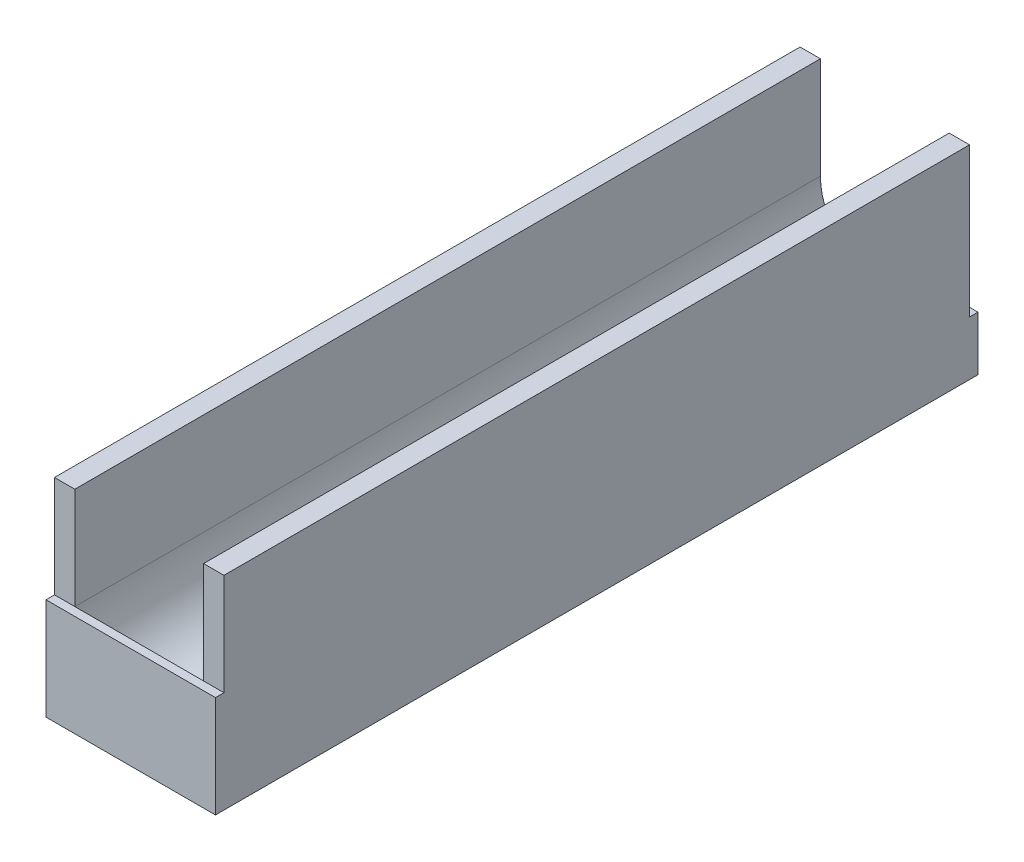
ISO-10303-21;
HEADER;
FILE_DESCRIPTION(('STEP AP214'),'2;1');
FILE_NAME('part.step','',(''),(''),'','','');
FILE_SCHEMA(('AUTOMOTIVE_DESIGN { 1 0 10303 214 1 1 1 1 }'));
ENDSEC;
DATA;
#1=APPLICATION_CONTEXT('core data for automotive mechanical design processes');
#2=APPLICATION_PROTOCOL_DEFINITION('international standard','automotive_design',2000,#1);
#3=PRODUCT_CONTEXT('',#1,'mechanical');
#4=PRODUCT('Part','Part','',(#3));
#5=PRODUCT_RELATED_PRODUCT_CATEGORY('part','',(#4));
#6=PRODUCT_DEFINITION_FORMATION('','',#4);
#7=PRODUCT_DEFINITION_CONTEXT('part definition',#1,'design');
#8=PRODUCT_DEFINITION('design','',#6,#7);
#9=PRODUCT_DEFINITION_SHAPE('','',#8);
#10=(LENGTH_UNIT() NAMED_UNIT(*) SI_UNIT(.MILLI.,.METRE.));
#11=(NAMED_UNIT(*) PLANE_ANGLE_UNIT() SI_UNIT($,.RADIAN.));
#12=(NAMED_UNIT(*) SI_UNIT($,.STERADIAN.) SOLID_ANGLE_UNIT());
#13=UNCERTAINTY_MEASURE_WITH_UNIT(LENGTH_MEASURE(1.E-05),#10,'distance_accuracy_value','');
#14=(GEOMETRIC_REPRESENTATION_CONTEXT(3) GLOBAL_UNCERTAINTY_ASSIGNED_CONTEXT((#13)) GLOBAL_UNIT_ASSIGNED_CONTEXT((#10,
#11,#12)) REPRESENTATION_CONTEXT('',''));
#15=CARTESIAN_POINT('',(0.,0.,0.));
#16=DIRECTION('',(0.,0.,1.));
#17=DIRECTION('',(1.,0.,0.));
#18=AXIS2_PLACEMENT_3D('',#15,#16,#17);
#19=CARTESIAN_POINT('',(0.,0.,0.));
#20=DIRECTION('',(0.,0.,-1.));
#21=DIRECTION('',(-1.,0.,0.));
#22=AXIS2_PLACEMENT_3D('',#19,#20,#21);
#23=PLANE('',#22);
#24=DIRECTION('',(1.,0.,0.));
#25=VECTOR('',#24,1.);
#26=CARTESIAN_POINT('',(15.875,10.16,0.));
#27=LINE('',#26,#25);
#28=CARTESIAN_POINT('',(-15.875,10.16,0.));
#29=VERTEX_POINT('',#28);
#30=CARTESIAN_POINT('',(-8.15672268745235,10.16,0.));
#31=VERTEX_POINT('',#30);
#32=EDGE_CURVE('E48',#29,#31,#27,.T.);
#33=ORIENTED_EDGE('',*,*,#32,.F.);
#34=DIRECTION('',(0.,-1.,0.));
#35=VECTOR('',#34,1.);
#36=CARTESIAN_POINT('',(-15.875,0.,0.));
#37=LINE('',#36,#35);
#38=CARTESIAN_POINT('',(-15.875,38.1,0.));
#39=VERTEX_POINT('',#38);
#40=EDGE_CURVE('E220',#39,#29,#37,.T.);
#41=ORIENTED_EDGE('',*,*,#40,.F.);
#42=DIRECTION('',(-1.,0.,0.));
#43=VECTOR('',#42,1.);
#44=CARTESIAN_POINT('',(-15.875,38.1,0.));
#45=LINE('',#44,#43);
#46=CARTESIAN_POINT('',(-12.065,38.1,0.));
#47=VERTEX_POINT('',#46);
#48=EDGE_CURVE('E240',#47,#39,#45,.T.);
#49=ORIENTED_EDGE('',*,*,#48,.F.);
#50=DIRECTION('',(0.,-1.,0.));
#51=VECTOR('',#50,1.);
#52=CARTESIAN_POINT('',(-12.065,19.05,0.));
#53=LINE('',#52,#51);
#54=CARTESIAN_POINT('',(-12.065,19.05,0.));
#55=VERTEX_POINT('',#54);
#56=EDGE_CURVE('E206',#47,#55,#53,.T.);
#57=ORIENTED_EDGE('',*,*,#56,.T.);
#58=CARTESIAN_POINT('',(0.,19.05,0.));
#59=DIRECTION('',(0.,0.,1.));
#60=DIRECTION('',(1.,0.,0.));
#61=AXIS2_PLACEMENT_3D('',#58,#59,#60);
#62=CIRCLE('',#61,12.065);
#63=EDGE_CURVE('E199',#55,#31,#62,.T.);
#64=ORIENTED_EDGE('',*,*,#63,.T.);
#65=EDGE_LOOP('',(#33,#41,#49,#57,#64));
#66=FACE_BOUND('',#65,.T.);
#67=ADVANCED_FACE('F37',(#66),#23,.T.);
#68=CARTESIAN_POINT('',(0.,0.,139.7));
#69=DIRECTION('',(0.,0.,-1.));
#70=DIRECTION('',(-1.,0.,0.));
#71=AXIS2_PLACEMENT_3D('',#68,#69,#70);
#72=PLANE('',#71);
#73=DIRECTION('',(-1.,0.,0.));
#74=VECTOR('',#73,1.);
#75=CARTESIAN_POINT('',(15.875,19.05,139.7));
#76=LINE('',#75,#74);
#77=CARTESIAN_POINT('',(15.875,19.05,139.7));
#78=VERTEX_POINT('',#77);
#79=CARTESIAN_POINT('',(12.065,19.05,139.7));
#80=VERTEX_POINT('',#79);
#81=EDGE_CURVE('E171',#78,#80,#76,.T.);
#82=ORIENTED_EDGE('',*,*,#81,.F.);
#83=DIRECTION('',(0.,1.,0.));
#84=VECTOR('',#83,1.);
#85=CARTESIAN_POINT('',(15.875,0.,139.7));
#86=LINE('',#85,#84);
#87=CARTESIAN_POINT('',(15.875,38.1,139.7));
#88=VERTEX_POINT('',#87);
#89=EDGE_CURVE('E229',#78,#88,#86,.T.);
#90=ORIENTED_EDGE('',*,*,#89,.T.);
#91=DIRECTION('',(-1.,0.,0.));
#92=VECTOR('',#91,1.);
#93=CARTESIAN_POINT('',(-15.875,38.1,139.7));
#94=LINE('',#93,#92);
#95=CARTESIAN_POINT('',(12.065,38.1,139.7));
#96=VERTEX_POINT('',#95);
#97=EDGE_CURVE('E233',#88,#96,#94,.T.);
#98=ORIENTED_EDGE('',*,*,#97,.T.);
#99=DIRECTION('',(0.,1.,0.));
#100=VECTOR('',#99,1.);
#101=CARTESIAN_POINT('',(12.065,19.05,139.7));
#102=LINE('',#101,#100);
#103=EDGE_CURVE('E212',#80,#96,#102,.T.);
#104=ORIENTED_EDGE('',*,*,#103,.F.);
#105=EDGE_LOOP('',(#82,#90,#98,#104));
#106=FACE_BOUND('',#105,.T.);
#107=ADVANCED_FACE('F259',(#106),#72,.F.);
#108=CARTESIAN_POINT('',(-12.065,19.05,139.7));
#109=VERTEX_POINT('',#108);
#110=CARTESIAN_POINT('',(-15.875,19.05,139.7));
#111=VERTEX_POINT('',#110);
#112=EDGE_CURVE('E46',#109,#111,#76,.T.);
#113=ORIENTED_EDGE('',*,*,#112,.F.);
#114=DIRECTION('',(0.,-1.,0.));
#115=VECTOR('',#114,1.);
#116=CARTESIAN_POINT('',(-12.065,19.05,139.7));
#117=LINE('',#116,#115);
#118=CARTESIAN_POINT('',(-12.065,38.1,139.7));
#119=VERTEX_POINT('',#118);
#120=EDGE_CURVE('E214',#119,#109,#117,.T.);
#121=ORIENTED_EDGE('',*,*,#120,.F.);
#122=CARTESIAN_POINT('',(-15.875,38.1,139.7));
#123=VERTEX_POINT('',#122);
#124=EDGE_CURVE('E232',#119,#123,#94,.T.);
#125=ORIENTED_EDGE('',*,*,#124,.T.);
#126=DIRECTION('',(0.,-1.,0.));
#127=VECTOR('',#126,1.);
#128=CARTESIAN_POINT('',(-15.875,0.,139.7));
#129=LINE('',#128,#127);
#130=EDGE_CURVE('E227',#123,#111,#129,.T.);
#131=ORIENTED_EDGE('',*,*,#130,.T.);
#132=EDGE_LOOP('',(#113,#121,#125,#131));
#133=FACE_BOUND('',#132,.T.);
#134=ADVANCED_FACE('F284',(#133),#72,.F.);
#135=CARTESIAN_POINT('',(-15.875,38.1,139.7));
#136=DIRECTION('',(0.,-1.,0.));
#137=DIRECTION('',(0.,0.,-1.));
#138=AXIS2_PLACEMENT_3D('',#135,#136,#137);
#139=PLANE('',#138);
#140=ORIENTED_EDGE('',*,*,#124,.F.);
#141=DIRECTION('',(0.,0.,1.));
#142=VECTOR('',#141,1.);
#143=CARTESIAN_POINT('',(-12.065,38.1,0.));
#144=LINE('',#143,#142);
#145=EDGE_CURVE('E221',#47,#119,#144,.T.);
#146=ORIENTED_EDGE('',*,*,#145,.F.);
#147=ORIENTED_EDGE('',*,*,#48,.T.);
#148=DIRECTION('',(0.,0.,-1.));
#149=VECTOR('',#148,1.);
#150=CARTESIAN_POINT('',(-15.875,38.1,139.7));
#151=LINE('',#150,#149);
#152=EDGE_CURVE('E236',#123,#39,#151,.T.);
#153=ORIENTED_EDGE('',*,*,#152,.F.);
#154=EDGE_LOOP('',(#140,#146,#147,#153));
#155=FACE_BOUND('',#154,.T.);
#156=ADVANCED_FACE('F287',(#155),#139,.F.);
#157=CARTESIAN_POINT('',(-15.875,0.,139.7));
#158=DIRECTION('',(1.,0.,0.));
#159=DIRECTION('',(0.,0.,-1.));
#160=AXIS2_PLACEMENT_3D('',#157,#158,#159);
#161=PLANE('',#160);
#162=ORIENTED_EDGE('',*,*,#40,.T.);
#163=DIRECTION('',(0.,0.,1.));
#164=VECTOR('',#163,1.);
#165=CARTESIAN_POINT('',(-15.875,10.16,-1.5875));
#166=LINE('',#165,#164);
#167=CARTESIAN_POINT('',(-15.875,10.16,-1.5875));
#168=VERTEX_POINT('',#167);
#169=EDGE_CURVE('E165',#168,#29,#166,.T.);
#170=ORIENTED_EDGE('',*,*,#169,.F.);
#171=DIRECTION('',(0.,1.,0.));
#172=VECTOR('',#171,1.);
#173=CARTESIAN_POINT('',(-15.875,0.,-1.5875));
#174=LINE('',#173,#172);
#175=CARTESIAN_POINT('',(-15.875,0.,-1.5875));
#176=VERTEX_POINT('',#175);
#177=EDGE_CURVE('E153',#176,#168,#174,.T.);
#178=ORIENTED_EDGE('',*,*,#177,.F.);
#179=DIRECTION('',(0.,0.,-1.));
#180=VECTOR('',#179,1.);
#181=CARTESIAN_POINT('',(-15.875,0.,139.7));
#182=LINE('',#181,#180);
#183=CARTESIAN_POINT('',(-15.875,0.,141.2875));
#184=VERTEX_POINT('',#183);
#185=EDGE_CURVE('E41',#184,#176,#182,.T.);
#186=ORIENTED_EDGE('',*,*,#185,.F.);
#187=DIRECTION('',(0.,-1.,0.));
#188=VECTOR('',#187,1.);
#189=CARTESIAN_POINT('',(-15.875,0.,141.2875));
#190=LINE('',#189,#188);
#191=CARTESIAN_POINT('',(-15.875,19.05,141.2875));
#192=VERTEX_POINT('',#191);
#193=EDGE_CURVE('E173',#192,#184,#190,.T.);
#194=ORIENTED_EDGE('',*,*,#193,.F.);
#195=DIRECTION('',(0.,0.,-1.));
#196=VECTOR('',#195,1.);
#197=CARTESIAN_POINT('',(-15.875,19.05,141.2875));
#198=LINE('',#197,#196);
#199=EDGE_CURVE('E178',#192,#111,#198,.T.);
#200=ORIENTED_EDGE('',*,*,#199,.T.);
#201=ORIENTED_EDGE('',*,*,#130,.F.);
#202=ORIENTED_EDGE('',*,*,#152,.T.);
#203=EDGE_LOOP('',(#162,#170,#178,#186,#194,#200,#201,#202));
#204=FACE_BOUND('',#203,.T.);
#205=ADVANCED_FACE('F39',(#204),#161,.F.);
#206=CARTESIAN_POINT('',(-15.875,0.,139.7));
#207=DIRECTION('',(0.,1.,0.));
#208=DIRECTION('',(0.,0.,1.));
#209=AXIS2_PLACEMENT_3D('',#206,#207,#208);
#210=PLANE('',#209);
#211=CARTESIAN_POINT('',(-12.7,0.,130.81));
#212=DIRECTION('',(0.,-1.,0.));
#213=DIRECTION('',(0.,0.,-1.));
#214=AXIS2_PLACEMENT_3D('',#211,#212,#213);
#215=CIRCLE('',#214,2.);
#216=CARTESIAN_POINT('',(-12.7,0.,128.81));
#217=VERTEX_POINT('',#216);
#218=EDGE_CURVE('E191',#217,#217,#215,.T.);
#219=ORIENTED_EDGE('',*,*,#218,.F.);
#220=EDGE_LOOP('',(#219));
#221=FACE_BOUND('',#220,.T.);
#222=CARTESIAN_POINT('',(12.7,0.,8.89));
#223=DIRECTION('',(0.,-1.,0.));
#224=DIRECTION('',(0.,0.,-1.));
#225=AXIS2_PLACEMENT_3D('',#222,#223,#224);
#226=CIRCLE('',#225,2.);
#227=CARTESIAN_POINT('',(12.7,0.,6.89));
#228=VERTEX_POINT('',#227);
#229=EDGE_CURVE('E194',#228,#228,#226,.T.);
#230=ORIENTED_EDGE('',*,*,#229,.F.);
#231=EDGE_LOOP('',(#230));
#232=FACE_BOUND('',#231,.T.);
#233=ORIENTED_EDGE('',*,*,#185,.T.);
#234=DIRECTION('',(-1.,0.,0.));
#235=VECTOR('',#234,1.);
#236=CARTESIAN_POINT('',(15.875,0.,-1.5875));
#237=LINE('',#236,#235);
#238=CARTESIAN_POINT('',(15.875,0.,-1.5875));
#239=VERTEX_POINT('',#238);
#240=EDGE_CURVE('E149',#239,#176,#237,.T.);
#241=ORIENTED_EDGE('',*,*,#240,.F.);
#242=DIRECTION('',(0.,0.,-1.));
#243=VECTOR('',#242,1.);
#244=CARTESIAN_POINT('',(15.875,0.,139.7));
#245=LINE('',#244,#243);
#246=CARTESIAN_POINT('',(15.875,0.,141.2875));
#247=VERTEX_POINT('',#246);
#248=EDGE_CURVE('E135',#247,#239,#245,.T.);
#249=ORIENTED_EDGE('',*,*,#248,.F.);
#250=DIRECTION('',(1.,0.,0.));
#251=VECTOR('',#250,1.);
#252=CARTESIAN_POINT('',(15.875,0.,141.2875));
#253=LINE('',#252,#251);
#254=EDGE_CURVE('E176',#184,#247,#253,.T.);
#255=ORIENTED_EDGE('',*,*,#254,.F.);
#256=EDGE_LOOP('',(#233,#241,#249,#255));
#257=FACE_BOUND('',#256,.T.);
#258=ADVANCED_FACE('F150',(#221,#232,#257),#210,.F.);
#259=CARTESIAN_POINT('',(15.875,0.,139.7));
#260=DIRECTION('',(-1.,0.,0.));
#261=DIRECTION('',(0.,0.,1.));
#262=AXIS2_PLACEMENT_3D('',#259,#260,#261);
#263=PLANE('',#262);
#264=ORIENTED_EDGE('',*,*,#248,.T.);
#265=DIRECTION('',(0.,-1.,0.));
#266=VECTOR('',#265,1.);
#267=CARTESIAN_POINT('',(15.875,0.,-1.5875));
#268=LINE('',#267,#266);
#269=CARTESIAN_POINT('',(15.875,10.16,-1.5875));
#270=VERTEX_POINT('',#269);
#271=EDGE_CURVE('E140',#270,#239,#268,.T.);
#272=ORIENTED_EDGE('',*,*,#271,.F.);
#273=DIRECTION('',(0.,0.,1.));
#274=VECTOR('',#273,1.);
#275=CARTESIAN_POINT('',(15.875,10.16,-1.5875));
#276=LINE('',#275,#274);
#277=CARTESIAN_POINT('',(15.875,10.16,0.));
#278=VERTEX_POINT('',#277);
#279=EDGE_CURVE('E162',#270,#278,#276,.T.);
#280=ORIENTED_EDGE('',*,*,#279,.T.);
#281=DIRECTION('',(0.,1.,0.));
#282=VECTOR('',#281,1.);
#283=CARTESIAN_POINT('',(15.875,0.,0.));
#284=LINE('',#283,#282);
#285=CARTESIAN_POINT('',(15.875,38.1,0.));
#286=VERTEX_POINT('',#285);
#287=EDGE_CURVE('E238',#278,#286,#284,.T.);
#288=ORIENTED_EDGE('',*,*,#287,.T.);
#289=DIRECTION('',(0.,0.,-1.));
#290=VECTOR('',#289,1.);
#291=CARTESIAN_POINT('',(15.875,38.1,139.7));
#292=LINE('',#291,#290);
#293=EDGE_CURVE('E147',#88,#286,#292,.T.);
#294=ORIENTED_EDGE('',*,*,#293,.F.);
#295=ORIENTED_EDGE('',*,*,#89,.F.);
#296=DIRECTION('',(0.,0.,-1.));
#297=VECTOR('',#296,1.);
#298=CARTESIAN_POINT('',(15.875,19.05,141.2875));
#299=LINE('',#298,#297);
#300=CARTESIAN_POINT('',(15.875,19.05,141.2875));
#301=VERTEX_POINT('',#300);
#302=EDGE_CURVE('E183',#301,#78,#299,.T.);
#303=ORIENTED_EDGE('',*,*,#302,.F.);
#304=DIRECTION('',(0.,1.,0.));
#305=VECTOR('',#304,1.);
#306=CARTESIAN_POINT('',(15.875,0.,141.2875));
#307=LINE('',#306,#305);
#308=EDGE_CURVE('E143',#247,#301,#307,.T.);
#309=ORIENTED_EDGE('',*,*,#308,.F.);
#310=EDGE_LOOP('',(#264,#272,#280,#288,#294,#295,#303,#309));
#311=FACE_BOUND('',#310,.T.);
#312=ADVANCED_FACE('F137',(#311),#263,.F.);
#313=CARTESIAN_POINT('',(12.065,38.1,0.));
#314=VERTEX_POINT('',#313);
#315=EDGE_CURVE('E230',#286,#314,#45,.T.);
#316=ORIENTED_EDGE('',*,*,#315,.T.);
#317=DIRECTION('',(0.,0.,1.));
#318=VECTOR('',#317,1.);
#319=CARTESIAN_POINT('',(12.065,38.1,0.));
#320=LINE('',#319,#318);
#321=EDGE_CURVE('E223',#314,#96,#320,.T.);
#322=ORIENTED_EDGE('',*,*,#321,.T.);
#323=ORIENTED_EDGE('',*,*,#97,.F.);
#324=ORIENTED_EDGE('',*,*,#293,.T.);
#325=EDGE_LOOP('',(#316,#322,#323,#324));
#326=FACE_BOUND('',#325,.T.);
#327=ADVANCED_FACE('F250',(#326),#139,.F.);
#328=CARTESIAN_POINT('',(8.15672268745235,10.16,0.));
#329=VERTEX_POINT('',#328);
#330=EDGE_CURVE('E11',#329,#278,#27,.T.);
#331=ORIENTED_EDGE('',*,*,#330,.F.);
#332=CARTESIAN_POINT('',(12.065,19.05,0.));
#333=VERTEX_POINT('',#332);
#334=EDGE_CURVE('E203',#329,#333,#62,.T.);
#335=ORIENTED_EDGE('',*,*,#334,.T.);
#336=DIRECTION('',(0.,1.,0.));
#337=VECTOR('',#336,1.);
#338=CARTESIAN_POINT('',(12.065,19.05,0.));
#339=LINE('',#338,#337);
#340=EDGE_CURVE('E201',#333,#314,#339,.T.);
#341=ORIENTED_EDGE('',*,*,#340,.T.);
#342=ORIENTED_EDGE('',*,*,#315,.F.);
#343=ORIENTED_EDGE('',*,*,#287,.F.);
#344=EDGE_LOOP('',(#331,#335,#341,#342,#343));
#345=FACE_BOUND('',#344,.T.);
#346=ADVANCED_FACE('F252',(#345),#23,.T.);
#347=CARTESIAN_POINT('',(0.,19.05,0.));
#348=DIRECTION('',(0.,0.,1.));
#349=DIRECTION('',(1.,0.,0.));
#350=AXIS2_PLACEMENT_3D('',#347,#348,#349);
#351=CYLINDRICAL_SURFACE('',#350,12.065);
#352=CARTESIAN_POINT('',(0.,19.05,139.7));
#353=DIRECTION('',(0.,0.,1.));
#354=DIRECTION('',(1.,0.,0.));
#355=AXIS2_PLACEMENT_3D('',#352,#353,#354);
#356=CIRCLE('',#355,12.065);
#357=EDGE_CURVE('E190',#109,#80,#356,.T.);
#358=ORIENTED_EDGE('',*,*,#357,.T.);
#359=DIRECTION('',(0.,0.,1.));
#360=VECTOR('',#359,1.);
#361=CARTESIAN_POINT('',(12.065,19.05,0.));
#362=LINE('',#361,#360);
#363=EDGE_CURVE('E209',#333,#80,#362,.T.);
#364=ORIENTED_EDGE('',*,*,#363,.F.);
#365=ORIENTED_EDGE('',*,*,#334,.F.);
#366=EDGE_CURVE('E202',#31,#329,#62,.T.);
#367=ORIENTED_EDGE('',*,*,#366,.F.);
#368=ORIENTED_EDGE('',*,*,#63,.F.);
#369=DIRECTION('',(0.,0.,1.));
#370=VECTOR('',#369,1.);
#371=CARTESIAN_POINT('',(-12.065,19.05,0.));
#372=LINE('',#371,#370);
#373=EDGE_CURVE('E217',#55,#109,#372,.T.);
#374=ORIENTED_EDGE('',*,*,#373,.T.);
#375=EDGE_LOOP('',(#358,#364,#365,#367,#368,#374));
#376=FACE_BOUND('',#375,.T.);
#377=ADVANCED_FACE('F276',(#376),#351,.F.);
#378=CARTESIAN_POINT('',(-12.065,19.05,0.));
#379=DIRECTION('',(-1.,0.,0.));
#380=DIRECTION('',(0.,0.,1.));
#381=AXIS2_PLACEMENT_3D('',#378,#379,#380);
#382=PLANE('',#381);
#383=ORIENTED_EDGE('',*,*,#120,.T.);
#384=ORIENTED_EDGE('',*,*,#373,.F.);
#385=ORIENTED_EDGE('',*,*,#56,.F.);
#386=ORIENTED_EDGE('',*,*,#145,.T.);
#387=EDGE_LOOP('',(#383,#384,#385,#386));
#388=FACE_BOUND('',#387,.T.);
#389=ADVANCED_FACE('F280',(#388),#382,.F.);
#390=CARTESIAN_POINT('',(12.065,19.05,0.));
#391=DIRECTION('',(1.,0.,0.));
#392=DIRECTION('',(0.,0.,-1.));
#393=AXIS2_PLACEMENT_3D('',#390,#391,#392);
#394=PLANE('',#393);
#395=ORIENTED_EDGE('',*,*,#103,.T.);
#396=ORIENTED_EDGE('',*,*,#321,.F.);
#397=ORIENTED_EDGE('',*,*,#340,.F.);
#398=ORIENTED_EDGE('',*,*,#363,.T.);
#399=EDGE_LOOP('',(#395,#396,#397,#398));
#400=FACE_BOUND('',#399,.T.);
#401=ADVANCED_FACE('F256',(#400),#394,.F.);
#402=CARTESIAN_POINT('',(12.7,7.,8.89));
#403=DIRECTION('',(0.,-1.,0.));
#404=DIRECTION('',(0.,0.,-1.));
#405=AXIS2_PLACEMENT_3D('',#402,#403,#404);
#406=CYLINDRICAL_SURFACE('',#405,2.);
#407=CARTESIAN_POINT('',(12.7,7.,8.89));
#408=DIRECTION('',(0.,-1.,0.));
#409=DIRECTION('',(0.,0.,-1.));
#410=AXIS2_PLACEMENT_3D('',#407,#408,#409);
#411=CIRCLE('',#410,2.);
#412=CARTESIAN_POINT('',(12.7,7.,6.89));
#413=VERTEX_POINT('',#412);
#414=EDGE_CURVE('E186',#413,#413,#411,.T.);
#415=ORIENTED_EDGE('',*,*,#414,.F.);
#416=EDGE_LOOP('',(#415));
#417=FACE_BOUND('',#416,.T.);
#418=ORIENTED_EDGE('',*,*,#229,.T.);
#419=EDGE_LOOP('',(#418));
#420=FACE_BOUND('',#419,.T.);
#421=ADVANCED_FACE('F333',(#417,#420),#406,.F.);
#422=CARTESIAN_POINT('',(12.7,7.,8.89));
#423=DIRECTION('',(0.,-1.,0.));
#424=DIRECTION('',(0.,0.,-1.));
#425=AXIS2_PLACEMENT_3D('',#422,#423,#424);
#426=PLANE('',#425);
#427=ORIENTED_EDGE('',*,*,#414,.T.);
#428=EDGE_LOOP('',(#427));
#429=FACE_BOUND('',#428,.T.);
#430=ADVANCED_FACE('F336',(#429),#426,.T.);
#431=CARTESIAN_POINT('',(-12.7,7.,130.81));
#432=DIRECTION('',(0.,-1.,0.));
#433=DIRECTION('',(0.,0.,-1.));
#434=AXIS2_PLACEMENT_3D('',#431,#432,#433);
#435=CYLINDRICAL_SURFACE('',#434,2.);
#436=CARTESIAN_POINT('',(-12.7,7.,130.81));
#437=DIRECTION('',(0.,-1.,0.));
#438=DIRECTION('',(0.,0.,-1.));
#439=AXIS2_PLACEMENT_3D('',#436,#437,#438);
#440=CIRCLE('',#439,2.);
#441=CARTESIAN_POINT('',(-12.7,7.,128.81));
#442=VERTEX_POINT('',#441);
#443=EDGE_CURVE('E187',#442,#442,#440,.T.);
#444=ORIENTED_EDGE('',*,*,#443,.F.);
#445=EDGE_LOOP('',(#444));
#446=FACE_BOUND('',#445,.T.);
#447=ORIENTED_EDGE('',*,*,#218,.T.);
#448=EDGE_LOOP('',(#447));
#449=FACE_BOUND('',#448,.T.);
#450=ADVANCED_FACE('F339',(#446,#449),#435,.F.);
#451=CARTESIAN_POINT('',(-12.7,7.,130.81));
#452=DIRECTION('',(0.,-1.,0.));
#453=DIRECTION('',(0.,0.,-1.));
#454=AXIS2_PLACEMENT_3D('',#451,#452,#453);
#455=PLANE('',#454);
#456=ORIENTED_EDGE('',*,*,#443,.T.);
#457=EDGE_LOOP('',(#456));
#458=FACE_BOUND('',#457,.T.);
#459=ADVANCED_FACE('F346',(#458),#455,.T.);
#460=CARTESIAN_POINT('',(15.875,19.05,141.2875));
#461=DIRECTION('',(0.,-1.,0.));
#462=DIRECTION('',(1.,0.,0.));
#463=AXIS2_PLACEMENT_3D('',#460,#461,#462);
#464=PLANE('',#463);
#465=ORIENTED_EDGE('',*,*,#81,.T.);
#466=EDGE_CURVE('E168',#80,#109,#76,.T.);
#467=ORIENTED_EDGE('',*,*,#466,.T.);
#468=ORIENTED_EDGE('',*,*,#112,.T.);
#469=ORIENTED_EDGE('',*,*,#199,.F.);
#470=DIRECTION('',(-1.,0.,0.));
#471=VECTOR('',#470,1.);
#472=CARTESIAN_POINT('',(15.875,19.05,141.2875));
#473=LINE('',#472,#471);
#474=EDGE_CURVE('E170',#301,#192,#473,.T.);
#475=ORIENTED_EDGE('',*,*,#474,.F.);
#476=ORIENTED_EDGE('',*,*,#302,.T.);
#477=EDGE_LOOP('',(#465,#467,#468,#469,#475,#476));
#478=FACE_BOUND('',#477,.T.);
#479=ADVANCED_FACE('F262',(#478),#464,.F.);
#480=CARTESIAN_POINT('',(0.,0.,141.2875));
#481=DIRECTION('',(0.,0.,1.));
#482=DIRECTION('',(1.,0.,0.));
#483=AXIS2_PLACEMENT_3D('',#480,#481,#482);
#484=PLANE('',#483);
#485=ORIENTED_EDGE('',*,*,#308,.T.);
#486=ORIENTED_EDGE('',*,*,#474,.T.);
#487=ORIENTED_EDGE('',*,*,#193,.T.);
#488=ORIENTED_EDGE('',*,*,#254,.T.);
#489=EDGE_LOOP('',(#485,#486,#487,#488));
#490=FACE_BOUND('',#489,.T.);
#491=ADVANCED_FACE('F268',(#490),#484,.T.);
#492=CARTESIAN_POINT('',(0.,0.,139.7));
#493=DIRECTION('',(0.,0.,1.));
#494=DIRECTION('',(1.,0.,0.));
#495=AXIS2_PLACEMENT_3D('',#492,#493,#494);
#496=PLANE('',#495);
#497=ORIENTED_EDGE('',*,*,#357,.F.);
#498=ORIENTED_EDGE('',*,*,#466,.F.);
#499=EDGE_LOOP('',(#497,#498));
#500=FACE_BOUND('',#499,.T.);
#501=ADVANCED_FACE('F274',(#500),#496,.F.);
#502=CARTESIAN_POINT('',(15.875,10.16,-1.5875));
#503=DIRECTION('',(0.,-1.,0.));
#504=DIRECTION('',(0.,0.,-1.));
#505=AXIS2_PLACEMENT_3D('',#502,#503,#504);
#506=PLANE('',#505);
#507=ORIENTED_EDGE('',*,*,#32,.T.);
#508=EDGE_CURVE('E49',#31,#329,#27,.T.);
#509=ORIENTED_EDGE('',*,*,#508,.T.);
#510=ORIENTED_EDGE('',*,*,#330,.T.);
#511=ORIENTED_EDGE('',*,*,#279,.F.);
#512=DIRECTION('',(1.,0.,0.));
#513=VECTOR('',#512,1.);
#514=CARTESIAN_POINT('',(15.875,10.16,-1.5875));
#515=LINE('',#514,#513);
#516=EDGE_CURVE('E157',#168,#270,#515,.T.);
#517=ORIENTED_EDGE('',*,*,#516,.F.);
#518=ORIENTED_EDGE('',*,*,#169,.T.);
#519=EDGE_LOOP('',(#507,#509,#510,#511,#517,#518));
#520=FACE_BOUND('',#519,.T.);
#521=ADVANCED_FACE('F295',(#520),#506,.F.);
#522=CARTESIAN_POINT('',(0.,0.,-1.5875));
#523=DIRECTION('',(0.,0.,1.));
#524=DIRECTION('',(1.,0.,0.));
#525=AXIS2_PLACEMENT_3D('',#522,#523,#524);
#526=PLANE('',#525);
#527=ORIENTED_EDGE('',*,*,#271,.T.);
#528=ORIENTED_EDGE('',*,*,#240,.T.);
#529=ORIENTED_EDGE('',*,*,#177,.T.);
#530=ORIENTED_EDGE('',*,*,#516,.T.);
#531=EDGE_LOOP('',(#527,#528,#529,#530));
#532=FACE_BOUND('',#531,.T.);
#533=ADVANCED_FACE('F155',(#532),#526,.F.);
#534=CARTESIAN_POINT('',(0.,0.,0.));
#535=DIRECTION('',(0.,0.,1.));
#536=DIRECTION('',(1.,0.,0.));
#537=AXIS2_PLACEMENT_3D('',#534,#535,#536);
#538=PLANE('',#537);
#539=ORIENTED_EDGE('',*,*,#508,.F.);
#540=ORIENTED_EDGE('',*,*,#366,.T.);
#541=EDGE_LOOP('',(#539,#540));
#542=FACE_BOUND('',#541,.T.);
#543=ADVANCED_FACE('F293',(#542),#538,.T.);
#544=CLOSED_SHELL('',(#67,#107,#134,#156,#205,#258,#312,#327,#346,#377,#389,#401,#421,#430,#450,
#459,#479,#491,#501,#521,#533,#543));
#545=MANIFOLD_SOLID_BREP('B2',#544);
#546=ADVANCED_BREP_SHAPE_REPRESENTATION('',(#18,#545),#14);
#547=SHAPE_DEFINITION_REPRESENTATION(#9,#546);
ENDSEC;
END-ISO-10303-21;
